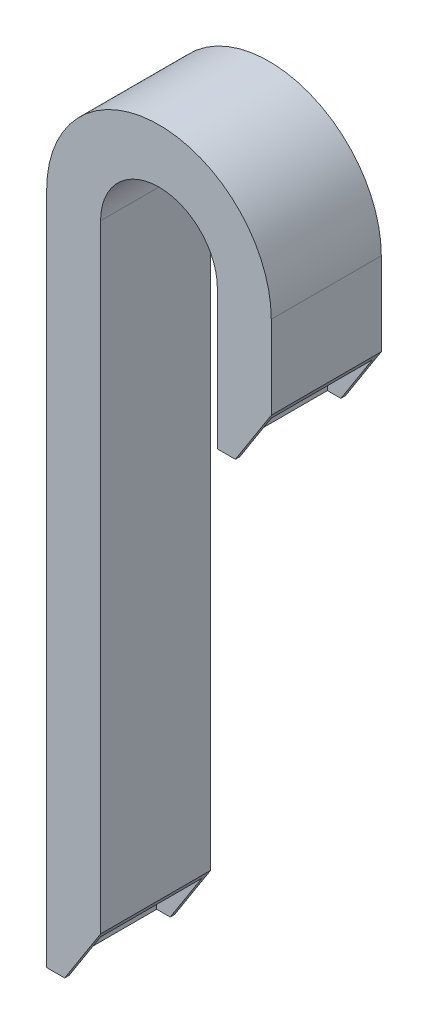
ISO-10303-21;
HEADER;
FILE_DESCRIPTION(('STEP AP214'),'2;1');
FILE_NAME('part.step','',(''),(''),'','','');
FILE_SCHEMA(('AUTOMOTIVE_DESIGN { 1 0 10303 214 1 1 1 1 }'));
ENDSEC;
DATA;
#1=APPLICATION_CONTEXT('core data for automotive mechanical design processes');
#2=APPLICATION_PROTOCOL_DEFINITION('international standard','automotive_design',2000,#1);
#3=PRODUCT_CONTEXT('',#1,'mechanical');
#4=PRODUCT('Part','Part','',(#3));
#5=PRODUCT_RELATED_PRODUCT_CATEGORY('part','',(#4));
#6=PRODUCT_DEFINITION_FORMATION('','',#4);
#7=PRODUCT_DEFINITION_CONTEXT('part definition',#1,'design');
#8=PRODUCT_DEFINITION('design','',#6,#7);
#9=PRODUCT_DEFINITION_SHAPE('','',#8);
#10=(LENGTH_UNIT() NAMED_UNIT(*) SI_UNIT(.MILLI.,.METRE.));
#11=(NAMED_UNIT(*) PLANE_ANGLE_UNIT() SI_UNIT($,.RADIAN.));
#12=(NAMED_UNIT(*) SI_UNIT($,.STERADIAN.) SOLID_ANGLE_UNIT());
#13=UNCERTAINTY_MEASURE_WITH_UNIT(LENGTH_MEASURE(1.E-05),#10,'distance_accuracy_value','');
#14=(GEOMETRIC_REPRESENTATION_CONTEXT(3) GLOBAL_UNCERTAINTY_ASSIGNED_CONTEXT((#13)) GLOBAL_UNIT_ASSIGNED_CONTEXT((#10,
#11,#12)) REPRESENTATION_CONTEXT('',''));
#15=CARTESIAN_POINT('',(0.,0.,0.));
#16=DIRECTION('',(0.,0.,1.));
#17=DIRECTION('',(1.,0.,0.));
#18=AXIS2_PLACEMENT_3D('',#15,#16,#17);
#19=CARTESIAN_POINT('',(88.,238.,24.5));
#20=DIRECTION('',(0.,-1.,0.));
#21=DIRECTION('',(0.,0.,-1.));
#22=AXIS2_PLACEMENT_3D('',#19,#20,#21);
#23=PLANE('',#22);
#24=DIRECTION('',(0.,0.,1.));
#25=VECTOR('',#24,1.);
#26=CARTESIAN_POINT('',(72.,238.,-24.5));
#27=LINE('',#26,#25);
#28=CARTESIAN_POINT('',(72.,238.,22.5));
#29=VERTEX_POINT('',#28);
#30=CARTESIAN_POINT('',(72.,238.,24.5));
#31=VERTEX_POINT('',#30);
#32=EDGE_CURVE('E236',#29,#31,#27,.T.);
#33=ORIENTED_EDGE('',*,*,#32,.T.);
#34=DIRECTION('',(-1.,0.,0.));
#35=VECTOR('',#34,1.);
#36=CARTESIAN_POINT('',(88.,238.,24.5));
#37=LINE('',#36,#35);
#38=CARTESIAN_POINT('',(64.,238.,24.5));
#39=VERTEX_POINT('',#38);
#40=EDGE_CURVE('E271',#31,#39,#37,.T.);
#41=ORIENTED_EDGE('',*,*,#40,.T.);
#42=DIRECTION('',(0.,0.,-1.));
#43=VECTOR('',#42,1.);
#44=CARTESIAN_POINT('',(64.,238.,24.5));
#45=LINE('',#44,#43);
#46=CARTESIAN_POINT('',(64.,238.,-24.5));
#47=VERTEX_POINT('',#46);
#48=EDGE_CURVE('E219',#39,#47,#45,.T.);
#49=ORIENTED_EDGE('',*,*,#48,.T.);
#50=DIRECTION('',(-1.,0.,0.));
#51=VECTOR('',#50,1.);
#52=CARTESIAN_POINT('',(88.,238.,-24.5));
#53=LINE('',#52,#51);
#54=CARTESIAN_POINT('',(72.,238.,-24.5));
#55=VERTEX_POINT('',#54);
#56=EDGE_CURVE('E235',#55,#47,#53,.T.);
#57=ORIENTED_EDGE('',*,*,#56,.F.);
#58=CARTESIAN_POINT('',(72.,238.,-22.5));
#59=VERTEX_POINT('',#58);
#60=EDGE_CURVE('E223',#55,#59,#27,.T.);
#61=ORIENTED_EDGE('',*,*,#60,.T.);
#62=DIRECTION('',(-1.,0.,0.));
#63=VECTOR('',#62,1.);
#64=CARTESIAN_POINT('',(88.,238.,-22.5));
#65=LINE('',#64,#63);
#66=CARTESIAN_POINT('',(66.,238.,-22.5));
#67=VERTEX_POINT('',#66);
#68=EDGE_CURVE('E233',#59,#67,#65,.T.);
#69=ORIENTED_EDGE('',*,*,#68,.T.);
#70=DIRECTION('',(0.,0.,-1.));
#71=VECTOR('',#70,1.);
#72=CARTESIAN_POINT('',(66.,238.,24.5));
#73=LINE('',#72,#71);
#74=CARTESIAN_POINT('',(66.,238.,22.5));
#75=VERTEX_POINT('',#74);
#76=EDGE_CURVE('E250',#75,#67,#73,.T.);
#77=ORIENTED_EDGE('',*,*,#76,.F.);
#78=DIRECTION('',(-1.,0.,0.));
#79=VECTOR('',#78,1.);
#80=CARTESIAN_POINT('',(88.,238.,22.5));
#81=LINE('',#80,#79);
#82=EDGE_CURVE('E252',#29,#75,#81,.T.);
#83=ORIENTED_EDGE('',*,*,#82,.F.);
#84=EDGE_LOOP('',(#33,#41,#49,#57,#61,#69,#77,#83));
#85=FACE_BOUND('',#84,.T.);
#86=ADVANCED_FACE('F39',(#85),#23,.T.);
#87=CARTESIAN_POINT('',(12.,0.,24.5));
#88=DIRECTION('',(0.,-1.,0.));
#89=DIRECTION('',(0.,0.,-1.));
#90=AXIS2_PLACEMENT_3D('',#87,#88,#89);
#91=PLANE('',#90);
#92=DIRECTION('',(0.,0.,1.));
#93=VECTOR('',#92,1.);
#94=CARTESIAN_POINT('',(-4.,0.,-24.5));
#95=LINE('',#94,#93);
#96=CARTESIAN_POINT('',(-4.,0.,22.5));
#97=VERTEX_POINT('',#96);
#98=CARTESIAN_POINT('',(-4.,0.,24.5));
#99=VERTEX_POINT('',#98);
#100=EDGE_CURVE('E192',#97,#99,#95,.T.);
#101=ORIENTED_EDGE('',*,*,#100,.T.);
#102=DIRECTION('',(-1.,0.,0.));
#103=VECTOR('',#102,1.);
#104=CARTESIAN_POINT('',(12.,0.,24.5));
#105=LINE('',#104,#103);
#106=CARTESIAN_POINT('',(-12.,0.,24.5));
#107=VERTEX_POINT('',#106);
#108=EDGE_CURVE('E282',#99,#107,#105,.T.);
#109=ORIENTED_EDGE('',*,*,#108,.T.);
#110=DIRECTION('',(0.,0.,-1.));
#111=VECTOR('',#110,1.);
#112=CARTESIAN_POINT('',(-12.,0.,24.5));
#113=LINE('',#112,#111);
#114=CARTESIAN_POINT('',(-12.,0.,-24.5));
#115=VERTEX_POINT('',#114);
#116=EDGE_CURVE('E212',#107,#115,#113,.T.);
#117=ORIENTED_EDGE('',*,*,#116,.T.);
#118=DIRECTION('',(-1.,0.,0.));
#119=VECTOR('',#118,1.);
#120=CARTESIAN_POINT('',(12.,0.,-24.5));
#121=LINE('',#120,#119);
#122=CARTESIAN_POINT('',(-4.,0.,-24.5));
#123=VERTEX_POINT('',#122);
#124=EDGE_CURVE('E198',#123,#115,#121,.T.);
#125=ORIENTED_EDGE('',*,*,#124,.F.);
#126=CARTESIAN_POINT('',(-4.,0.,-22.5));
#127=VERTEX_POINT('',#126);
#128=EDGE_CURVE('E179',#123,#127,#95,.T.);
#129=ORIENTED_EDGE('',*,*,#128,.T.);
#130=DIRECTION('',(-1.,0.,0.));
#131=VECTOR('',#130,1.);
#132=CARTESIAN_POINT('',(12.,0.,-22.5));
#133=LINE('',#132,#131);
#134=CARTESIAN_POINT('',(-10.,0.,-22.5));
#135=VERTEX_POINT('',#134);
#136=EDGE_CURVE('E265',#127,#135,#133,.T.);
#137=ORIENTED_EDGE('',*,*,#136,.T.);
#138=DIRECTION('',(0.,0.,-1.));
#139=VECTOR('',#138,1.);
#140=CARTESIAN_POINT('',(-10.,0.,24.5));
#141=LINE('',#140,#139);
#142=CARTESIAN_POINT('',(-10.,0.,22.5));
#143=VERTEX_POINT('',#142);
#144=EDGE_CURVE('E260',#143,#135,#141,.T.);
#145=ORIENTED_EDGE('',*,*,#144,.F.);
#146=DIRECTION('',(-1.,0.,0.));
#147=VECTOR('',#146,1.);
#148=CARTESIAN_POINT('',(12.,0.,22.5));
#149=LINE('',#148,#147);
#150=EDGE_CURVE('E256',#97,#143,#149,.T.);
#151=ORIENTED_EDGE('',*,*,#150,.F.);
#152=EDGE_LOOP('',(#101,#109,#117,#125,#129,#137,#145,#151));
#153=FACE_BOUND('',#152,.T.);
#154=ADVANCED_FACE('F366',(#153),#91,.T.);
#155=CARTESIAN_POINT('',(64.,300.,24.5));
#156=DIRECTION('',(1.,0.,0.));
#157=DIRECTION('',(0.,0.,-1.));
#158=AXIS2_PLACEMENT_3D('',#155,#156,#157);
#159=PLANE('',#158);
#160=CARTESIAN_POINT('',(64.,248.,-12.5));
#161=DIRECTION('',(1.,0.,0.));
#162=DIRECTION('',(0.,0.,-1.));
#163=AXIS2_PLACEMENT_3D('',#160,#161,#162);
#164=CIRCLE('',#163,2.25);
#165=CARTESIAN_POINT('',(64.,248.,-14.75));
#166=VERTEX_POINT('',#165);
#167=EDGE_CURVE('E388',#166,#166,#164,.T.);
#168=ORIENTED_EDGE('',*,*,#167,.T.);
#169=EDGE_LOOP('',(#168));
#170=FACE_BOUND('',#169,.T.);
#171=CARTESIAN_POINT('',(64.,248.,12.5));
#172=DIRECTION('',(1.,0.,0.));
#173=DIRECTION('',(0.,0.,-1.));
#174=AXIS2_PLACEMENT_3D('',#171,#172,#173);
#175=CIRCLE('',#174,2.24999999999997);
#176=CARTESIAN_POINT('',(64.,248.,10.25));
#177=VERTEX_POINT('',#176);
#178=EDGE_CURVE('E382',#177,#177,#175,.T.);
#179=ORIENTED_EDGE('',*,*,#178,.T.);
#180=EDGE_LOOP('',(#179));
#181=FACE_BOUND('',#180,.T.);
#182=DIRECTION('',(0.,1.,0.));
#183=VECTOR('',#182,1.);
#184=CARTESIAN_POINT('',(64.,300.,-24.5));
#185=LINE('',#184,#183);
#186=CARTESIAN_POINT('',(64.,300.,-24.5));
#187=VERTEX_POINT('',#186);
#188=EDGE_CURVE('E286',#187,#47,#185,.F.);
#189=ORIENTED_EDGE('',*,*,#188,.T.);
#190=ORIENTED_EDGE('',*,*,#48,.F.);
#191=DIRECTION('',(0.,1.,0.));
#192=VECTOR('',#191,1.);
#193=CARTESIAN_POINT('',(64.,300.,24.5));
#194=LINE('',#193,#192);
#195=CARTESIAN_POINT('',(64.,300.,24.5));
#196=VERTEX_POINT('',#195);
#197=EDGE_CURVE('E200',#196,#39,#194,.F.);
#198=ORIENTED_EDGE('',*,*,#197,.F.);
#199=DIRECTION('',(0.,0.,-1.));
#200=VECTOR('',#199,1.);
#201=CARTESIAN_POINT('',(64.,300.,24.5));
#202=LINE('',#201,#200);
#203=EDGE_CURVE('E206',#196,#187,#202,.T.);
#204=ORIENTED_EDGE('',*,*,#203,.T.);
#205=EDGE_LOOP('',(#189,#190,#198,#204));
#206=FACE_BOUND('',#205,.T.);
#207=ADVANCED_FACE('F41',(#170,#181,#206),#159,.F.);
#208=CARTESIAN_POINT('',(88.,300.,24.5));
#209=DIRECTION('',(1.,0.,0.));
#210=DIRECTION('',(0.,0.,-1.));
#211=AXIS2_PLACEMENT_3D('',#208,#209,#210);
#212=PLANE('',#211);
#213=DIRECTION('',(0.,0.,1.));
#214=VECTOR('',#213,1.);
#215=CARTESIAN_POINT('',(88.,263.,-24.5));
#216=LINE('',#215,#214);
#217=CARTESIAN_POINT('',(88.,263.,-24.5));
#218=VERTEX_POINT('',#217);
#219=CARTESIAN_POINT('',(88.,263.,24.5));
#220=VERTEX_POINT('',#219);
#221=EDGE_CURVE('E310',#218,#220,#216,.T.);
#222=ORIENTED_EDGE('',*,*,#221,.F.);
#223=DIRECTION('',(0.,1.,0.));
#224=VECTOR('',#223,1.);
#225=CARTESIAN_POINT('',(88.,300.,-24.5));
#226=LINE('',#225,#224);
#227=CARTESIAN_POINT('',(88.,300.,-24.5));
#228=VERTEX_POINT('',#227);
#229=EDGE_CURVE('E290',#228,#218,#226,.F.);
#230=ORIENTED_EDGE('',*,*,#229,.F.);
#231=DIRECTION('',(0.,0.,-1.));
#232=VECTOR('',#231,1.);
#233=CARTESIAN_POINT('',(88.,300.,24.5));
#234=LINE('',#233,#232);
#235=CARTESIAN_POINT('',(88.,300.,24.5));
#236=VERTEX_POINT('',#235);
#237=EDGE_CURVE('E217',#236,#228,#234,.T.);
#238=ORIENTED_EDGE('',*,*,#237,.F.);
#239=DIRECTION('',(0.,1.,0.));
#240=VECTOR('',#239,1.);
#241=CARTESIAN_POINT('',(88.,300.,24.5));
#242=LINE('',#241,#240);
#243=EDGE_CURVE('E273',#236,#220,#242,.F.);
#244=ORIENTED_EDGE('',*,*,#243,.T.);
#245=EDGE_LOOP('',(#222,#230,#238,#244));
#246=FACE_BOUND('',#245,.T.);
#247=ADVANCED_FACE('F309',(#246),#212,.T.);
#248=CARTESIAN_POINT('',(38.,300.,24.5));
#249=DIRECTION('',(0.,0.,-1.));
#250=DIRECTION('',(-1.,0.,0.));
#251=AXIS2_PLACEMENT_3D('',#248,#249,#250);
#252=CYLINDRICAL_SURFACE('',#251,50.);
#253=CARTESIAN_POINT('',(38.,300.,-24.5));
#254=DIRECTION('',(0.,0.,1.));
#255=DIRECTION('',(1.,0.,0.));
#256=AXIS2_PLACEMENT_3D('',#253,#254,#255);
#257=CIRCLE('',#256,50.);
#258=CARTESIAN_POINT('',(-12.,300.,-24.5));
#259=VERTEX_POINT('',#258);
#260=EDGE_CURVE('E293',#259,#228,#257,.F.);
#261=ORIENTED_EDGE('',*,*,#260,.F.);
#262=DIRECTION('',(0.,0.,-1.));
#263=VECTOR('',#262,1.);
#264=CARTESIAN_POINT('',(-12.,300.,24.5));
#265=LINE('',#264,#263);
#266=CARTESIAN_POINT('',(-12.,300.,24.5));
#267=VERTEX_POINT('',#266);
#268=EDGE_CURVE('E215',#267,#259,#265,.T.);
#269=ORIENTED_EDGE('',*,*,#268,.F.);
#270=CARTESIAN_POINT('',(38.,300.,24.5));
#271=DIRECTION('',(0.,0.,1.));
#272=DIRECTION('',(1.,0.,0.));
#273=AXIS2_PLACEMENT_3D('',#270,#271,#272);
#274=CIRCLE('',#273,50.);
#275=EDGE_CURVE('E276',#267,#236,#274,.F.);
#276=ORIENTED_EDGE('',*,*,#275,.T.);
#277=ORIENTED_EDGE('',*,*,#237,.T.);
#278=EDGE_LOOP('',(#261,#269,#276,#277));
#279=FACE_BOUND('',#278,.T.);
#280=ADVANCED_FACE('F304',(#279),#252,.T.);
#281=CARTESIAN_POINT('',(-12.,0.,24.5));
#282=DIRECTION('',(-1.,0.,0.));
#283=DIRECTION('',(0.,0.,1.));
#284=AXIS2_PLACEMENT_3D('',#281,#282,#283);
#285=PLANE('',#284);
#286=CARTESIAN_POINT('',(-12.,10.,-12.5));
#287=DIRECTION('',(1.,0.,0.));
#288=DIRECTION('',(0.,0.,-1.));
#289=AXIS2_PLACEMENT_3D('',#286,#287,#288);
#290=CIRCLE('',#289,2.25);
#291=CARTESIAN_POINT('',(-12.,10.,-14.75));
#292=VERTEX_POINT('',#291);
#293=EDGE_CURVE('E376',#292,#292,#290,.T.);
#294=ORIENTED_EDGE('',*,*,#293,.T.);
#295=EDGE_LOOP('',(#294));
#296=FACE_BOUND('',#295,.T.);
#297=CARTESIAN_POINT('',(-12.,10.,12.5));
#298=DIRECTION('',(1.,0.,0.));
#299=DIRECTION('',(0.,0.,-1.));
#300=AXIS2_PLACEMENT_3D('',#297,#298,#299);
#301=CIRCLE('',#300,2.25);
#302=CARTESIAN_POINT('',(-12.,10.,10.25));
#303=VERTEX_POINT('',#302);
#304=EDGE_CURVE('E369',#303,#303,#301,.T.);
#305=ORIENTED_EDGE('',*,*,#304,.T.);
#306=EDGE_LOOP('',(#305));
#307=FACE_BOUND('',#306,.T.);
#308=DIRECTION('',(0.,1.,0.));
#309=VECTOR('',#308,1.);
#310=CARTESIAN_POINT('',(-12.,0.,-24.5));
#311=LINE('',#310,#309);
#312=EDGE_CURVE('E202',#115,#259,#311,.T.);
#313=ORIENTED_EDGE('',*,*,#312,.F.);
#314=ORIENTED_EDGE('',*,*,#116,.F.);
#315=DIRECTION('',(0.,1.,0.));
#316=VECTOR('',#315,1.);
#317=CARTESIAN_POINT('',(-12.,0.,24.5));
#318=LINE('',#317,#316);
#319=EDGE_CURVE('E279',#107,#267,#318,.T.);
#320=ORIENTED_EDGE('',*,*,#319,.T.);
#321=ORIENTED_EDGE('',*,*,#268,.T.);
#322=EDGE_LOOP('',(#313,#314,#320,#321));
#323=FACE_BOUND('',#322,.T.);
#324=ADVANCED_FACE('F300',(#296,#307,#323),#285,.T.);
#325=CARTESIAN_POINT('',(12.,0.,24.5));
#326=DIRECTION('',(-1.,0.,0.));
#327=DIRECTION('',(0.,0.,1.));
#328=AXIS2_PLACEMENT_3D('',#325,#326,#327);
#329=PLANE('',#328);
#330=DIRECTION('',(0.,1.,0.));
#331=VECTOR('',#330,1.);
#332=CARTESIAN_POINT('',(12.,0.,24.5));
#333=LINE('',#332,#331);
#334=CARTESIAN_POINT('',(12.,25.,24.5));
#335=VERTEX_POINT('',#334);
#336=CARTESIAN_POINT('',(12.,300.,24.5));
#337=VERTEX_POINT('',#336);
#338=EDGE_CURVE('E191',#335,#337,#333,.T.);
#339=ORIENTED_EDGE('',*,*,#338,.F.);
#340=DIRECTION('',(0.,0.,1.));
#341=VECTOR('',#340,1.);
#342=CARTESIAN_POINT('',(12.,25.,-24.5));
#343=LINE('',#342,#341);
#344=CARTESIAN_POINT('',(12.,25.,-24.5));
#345=VERTEX_POINT('',#344);
#346=EDGE_CURVE('E176',#345,#335,#343,.T.);
#347=ORIENTED_EDGE('',*,*,#346,.F.);
#348=DIRECTION('',(0.,1.,0.));
#349=VECTOR('',#348,1.);
#350=CARTESIAN_POINT('',(12.,0.,-24.5));
#351=LINE('',#350,#349);
#352=CARTESIAN_POINT('',(12.,300.,-24.5));
#353=VERTEX_POINT('',#352);
#354=EDGE_CURVE('E189',#345,#353,#351,.T.);
#355=ORIENTED_EDGE('',*,*,#354,.T.);
#356=DIRECTION('',(0.,0.,-1.));
#357=VECTOR('',#356,1.);
#358=CARTESIAN_POINT('',(12.,300.,24.5));
#359=LINE('',#358,#357);
#360=EDGE_CURVE('E209',#337,#353,#359,.T.);
#361=ORIENTED_EDGE('',*,*,#360,.F.);
#362=EDGE_LOOP('',(#339,#347,#355,#361));
#363=FACE_BOUND('',#362,.T.);
#364=ADVANCED_FACE('F187',(#363),#329,.F.);
#365=CARTESIAN_POINT('',(38.,300.,24.5));
#366=DIRECTION('',(0.,0.,-1.));
#367=DIRECTION('',(-1.,0.,0.));
#368=AXIS2_PLACEMENT_3D('',#365,#366,#367);
#369=CYLINDRICAL_SURFACE('',#368,26.);
#370=CARTESIAN_POINT('',(38.,300.,-24.5));
#371=DIRECTION('',(0.,0.,1.));
#372=DIRECTION('',(1.,0.,0.));
#373=AXIS2_PLACEMENT_3D('',#370,#371,#372);
#374=CIRCLE('',#373,26.);
#375=EDGE_CURVE('E197',#353,#187,#374,.F.);
#376=ORIENTED_EDGE('',*,*,#375,.T.);
#377=ORIENTED_EDGE('',*,*,#203,.F.);
#378=CARTESIAN_POINT('',(38.,300.,24.5));
#379=DIRECTION('',(0.,0.,1.));
#380=DIRECTION('',(1.,0.,0.));
#381=AXIS2_PLACEMENT_3D('',#378,#379,#380);
#382=CIRCLE('',#381,26.);
#383=EDGE_CURVE('E210',#337,#196,#382,.F.);
#384=ORIENTED_EDGE('',*,*,#383,.F.);
#385=ORIENTED_EDGE('',*,*,#360,.T.);
#386=EDGE_LOOP('',(#376,#377,#384,#385));
#387=FACE_BOUND('',#386,.T.);
#388=ADVANCED_FACE('F431',(#387),#369,.F.);
#389=CARTESIAN_POINT('',(38.,300.,24.5));
#390=DIRECTION('',(0.,0.,1.));
#391=DIRECTION('',(1.,0.,0.));
#392=AXIS2_PLACEMENT_3D('',#389,#390,#391);
#393=PLANE('',#392);
#394=DIRECTION('',(-0.539053696423367,-0.842271400661511,0.));
#395=VECTOR('',#394,1.);
#396=CARTESIAN_POINT('',(-4.,0.,24.5));
#397=LINE('',#396,#395);
#398=EDGE_CURVE('E183',#335,#99,#397,.T.);
#399=ORIENTED_EDGE('',*,*,#398,.F.);
#400=ORIENTED_EDGE('',*,*,#338,.T.);
#401=ORIENTED_EDGE('',*,*,#383,.T.);
#402=ORIENTED_EDGE('',*,*,#197,.T.);
#403=ORIENTED_EDGE('',*,*,#40,.F.);
#404=DIRECTION('',(-0.539053696423367,-0.842271400661511,0.));
#405=VECTOR('',#404,1.);
#406=CARTESIAN_POINT('',(72.,238.,24.5));
#407=LINE('',#406,#405);
#408=EDGE_CURVE('E312',#220,#31,#407,.T.);
#409=ORIENTED_EDGE('',*,*,#408,.F.);
#410=ORIENTED_EDGE('',*,*,#243,.F.);
#411=ORIENTED_EDGE('',*,*,#275,.F.);
#412=ORIENTED_EDGE('',*,*,#319,.F.);
#413=ORIENTED_EDGE('',*,*,#108,.F.);
#414=EDGE_LOOP('',(#399,#400,#401,#402,#403,#409,#410,#411,#412,#413));
#415=FACE_BOUND('',#414,.T.);
#416=ADVANCED_FACE('F434',(#415),#393,.T.);
#417=CARTESIAN_POINT('',(38.,300.,-24.5));
#418=DIRECTION('',(0.,0.,1.));
#419=DIRECTION('',(1.,0.,0.));
#420=AXIS2_PLACEMENT_3D('',#417,#418,#419);
#421=PLANE('',#420);
#422=ORIENTED_EDGE('',*,*,#354,.F.);
#423=DIRECTION('',(-0.539053696423367,-0.842271400661511,0.));
#424=VECTOR('',#423,1.);
#425=CARTESIAN_POINT('',(-4.,0.,-24.5));
#426=LINE('',#425,#424);
#427=EDGE_CURVE('E173',#345,#123,#426,.T.);
#428=ORIENTED_EDGE('',*,*,#427,.T.);
#429=ORIENTED_EDGE('',*,*,#124,.T.);
#430=ORIENTED_EDGE('',*,*,#312,.T.);
#431=ORIENTED_EDGE('',*,*,#260,.T.);
#432=ORIENTED_EDGE('',*,*,#229,.T.);
#433=DIRECTION('',(-0.539053696423367,-0.842271400661511,0.));
#434=VECTOR('',#433,1.);
#435=CARTESIAN_POINT('',(72.,238.,-24.5));
#436=LINE('',#435,#434);
#437=EDGE_CURVE('E311',#218,#55,#436,.T.);
#438=ORIENTED_EDGE('',*,*,#437,.T.);
#439=ORIENTED_EDGE('',*,*,#56,.T.);
#440=ORIENTED_EDGE('',*,*,#188,.F.);
#441=ORIENTED_EDGE('',*,*,#375,.F.);
#442=EDGE_LOOP('',(#422,#428,#429,#430,#431,#432,#438,#439,#440,#441));
#443=FACE_BOUND('',#442,.T.);
#444=ADVANCED_FACE('F195',(#443),#421,.F.);
#445=CARTESIAN_POINT('',(66.,300.,24.5));
#446=DIRECTION('',(1.,0.,0.));
#447=DIRECTION('',(0.,0.,-1.));
#448=AXIS2_PLACEMENT_3D('',#445,#446,#447);
#449=PLANE('',#448);
#450=CARTESIAN_POINT('',(66.,248.,-12.5));
#451=DIRECTION('',(1.,0.,0.));
#452=DIRECTION('',(0.,0.,-1.));
#453=AXIS2_PLACEMENT_3D('',#450,#451,#452);
#454=CIRCLE('',#453,2.25);
#455=CARTESIAN_POINT('',(66.,248.,-14.75));
#456=VERTEX_POINT('',#455);
#457=EDGE_CURVE('E391',#456,#456,#454,.T.);
#458=ORIENTED_EDGE('',*,*,#457,.F.);
#459=EDGE_LOOP('',(#458));
#460=FACE_BOUND('',#459,.T.);
#461=CARTESIAN_POINT('',(66.,248.,12.5));
#462=DIRECTION('',(1.,0.,0.));
#463=DIRECTION('',(0.,0.,-1.));
#464=AXIS2_PLACEMENT_3D('',#461,#462,#463);
#465=CIRCLE('',#464,2.24999999999997);
#466=CARTESIAN_POINT('',(66.,248.,10.25));
#467=VERTEX_POINT('',#466);
#468=EDGE_CURVE('E385',#467,#467,#465,.T.);
#469=ORIENTED_EDGE('',*,*,#468,.F.);
#470=EDGE_LOOP('',(#469));
#471=FACE_BOUND('',#470,.T.);
#472=DIRECTION('',(0.,-1.,0.));
#473=VECTOR('',#472,1.);
#474=CARTESIAN_POINT('',(66.,300.,-22.5));
#475=LINE('',#474,#473);
#476=CARTESIAN_POINT('',(66.,300.,-22.5));
#477=VERTEX_POINT('',#476);
#478=EDGE_CURVE('E241',#477,#67,#475,.T.);
#479=ORIENTED_EDGE('',*,*,#478,.F.);
#480=DIRECTION('',(0.,0.,-1.));
#481=VECTOR('',#480,1.);
#482=CARTESIAN_POINT('',(66.,300.,24.5));
#483=LINE('',#482,#481);
#484=CARTESIAN_POINT('',(66.,300.,22.5));
#485=VERTEX_POINT('',#484);
#486=EDGE_CURVE('E326',#485,#477,#483,.T.);
#487=ORIENTED_EDGE('',*,*,#486,.F.);
#488=DIRECTION('',(0.,-1.,0.));
#489=VECTOR('',#488,1.);
#490=CARTESIAN_POINT('',(66.,300.,22.5));
#491=LINE('',#490,#489);
#492=EDGE_CURVE('E255',#485,#75,#491,.T.);
#493=ORIENTED_EDGE('',*,*,#492,.T.);
#494=ORIENTED_EDGE('',*,*,#76,.T.);
#495=EDGE_LOOP('',(#479,#487,#493,#494));
#496=FACE_BOUND('',#495,.T.);
#497=ADVANCED_FACE('F397',(#460,#471,#496),#449,.T.);
#498=CARTESIAN_POINT('',(86.,300.,24.5));
#499=DIRECTION('',(1.,0.,0.));
#500=DIRECTION('',(0.,0.,-1.));
#501=AXIS2_PLACEMENT_3D('',#498,#499,#500);
#502=PLANE('',#501);
#503=DIRECTION('',(0.,-1.,0.));
#504=VECTOR('',#503,1.);
#505=CARTESIAN_POINT('',(86.,300.,-22.5));
#506=LINE('',#505,#504);
#507=CARTESIAN_POINT('',(86.,300.,-22.5));
#508=VERTEX_POINT('',#507);
#509=CARTESIAN_POINT('',(86.,259.875,-22.5));
#510=VERTEX_POINT('',#509);
#511=EDGE_CURVE('E242',#508,#510,#506,.T.);
#512=ORIENTED_EDGE('',*,*,#511,.T.);
#513=DIRECTION('',(0.,0.,1.));
#514=VECTOR('',#513,1.);
#515=CARTESIAN_POINT('',(86.,259.875,24.5));
#516=LINE('',#515,#514);
#517=CARTESIAN_POINT('',(86.,259.875,22.5));
#518=VERTEX_POINT('',#517);
#519=EDGE_CURVE('E61',#510,#518,#516,.T.);
#520=ORIENTED_EDGE('',*,*,#519,.T.);
#521=DIRECTION('',(0.,-1.,0.));
#522=VECTOR('',#521,1.);
#523=CARTESIAN_POINT('',(86.,300.,22.5));
#524=LINE('',#523,#522);
#525=CARTESIAN_POINT('',(86.,300.,22.5));
#526=VERTEX_POINT('',#525);
#527=EDGE_CURVE('E254',#526,#518,#524,.T.);
#528=ORIENTED_EDGE('',*,*,#527,.F.);
#529=DIRECTION('',(0.,0.,-1.));
#530=VECTOR('',#529,1.);
#531=CARTESIAN_POINT('',(86.,300.,24.5));
#532=LINE('',#531,#530);
#533=EDGE_CURVE('E343',#526,#508,#532,.T.);
#534=ORIENTED_EDGE('',*,*,#533,.T.);
#535=EDGE_LOOP('',(#512,#520,#528,#534));
#536=FACE_BOUND('',#535,.T.);
#537=ADVANCED_FACE('F400',(#536),#502,.F.);
#538=CARTESIAN_POINT('',(38.,300.,24.5));
#539=DIRECTION('',(0.,0.,-1.));
#540=DIRECTION('',(-1.,0.,0.));
#541=AXIS2_PLACEMENT_3D('',#538,#539,#540);
#542=CYLINDRICAL_SURFACE('',#541,48.);
#543=CARTESIAN_POINT('',(38.,300.,-22.5));
#544=DIRECTION('',(0.,0.,1.));
#545=DIRECTION('',(1.,0.,0.));
#546=AXIS2_PLACEMENT_3D('',#543,#544,#545);
#547=CIRCLE('',#546,48.);
#548=CARTESIAN_POINT('',(-10.,300.,-22.5));
#549=VERTEX_POINT('',#548);
#550=EDGE_CURVE('E244',#549,#508,#547,.F.);
#551=ORIENTED_EDGE('',*,*,#550,.T.);
#552=ORIENTED_EDGE('',*,*,#533,.F.);
#553=CARTESIAN_POINT('',(38.,300.,22.5));
#554=DIRECTION('',(0.,0.,1.));
#555=DIRECTION('',(1.,0.,0.));
#556=AXIS2_PLACEMENT_3D('',#553,#554,#555);
#557=CIRCLE('',#556,48.);
#558=CARTESIAN_POINT('',(-10.,300.,22.5));
#559=VERTEX_POINT('',#558);
#560=EDGE_CURVE('E338',#559,#526,#557,.F.);
#561=ORIENTED_EDGE('',*,*,#560,.F.);
#562=DIRECTION('',(0.,0.,1.));
#563=VECTOR('',#562,1.);
#564=CARTESIAN_POINT('',(-10.,300.,24.5));
#565=LINE('',#564,#563);
#566=EDGE_CURVE('E263',#559,#549,#565,.F.);
#567=ORIENTED_EDGE('',*,*,#566,.T.);
#568=EDGE_LOOP('',(#551,#552,#561,#567));
#569=FACE_BOUND('',#568,.T.);
#570=ADVANCED_FACE('F357',(#569),#542,.F.);
#571=CARTESIAN_POINT('',(-10.,0.,24.5));
#572=DIRECTION('',(-1.,0.,0.));
#573=DIRECTION('',(0.,0.,1.));
#574=AXIS2_PLACEMENT_3D('',#571,#572,#573);
#575=PLANE('',#574);
#576=CARTESIAN_POINT('',(-10.,10.,-12.5));
#577=DIRECTION('',(1.,0.,0.));
#578=DIRECTION('',(0.,0.,-1.));
#579=AXIS2_PLACEMENT_3D('',#576,#577,#578);
#580=CIRCLE('',#579,2.24999999999999);
#581=CARTESIAN_POINT('',(-10.,10.,-14.75));
#582=VERTEX_POINT('',#581);
#583=EDGE_CURVE('E379',#582,#582,#580,.T.);
#584=ORIENTED_EDGE('',*,*,#583,.F.);
#585=EDGE_LOOP('',(#584));
#586=FACE_BOUND('',#585,.T.);
#587=CARTESIAN_POINT('',(-10.,10.,12.5));
#588=DIRECTION('',(1.,0.,0.));
#589=DIRECTION('',(0.,0.,-1.));
#590=AXIS2_PLACEMENT_3D('',#587,#588,#589);
#591=CIRCLE('',#590,2.24999999999999);
#592=CARTESIAN_POINT('',(-10.,10.,10.25));
#593=VERTEX_POINT('',#592);
#594=EDGE_CURVE('E373',#593,#593,#591,.T.);
#595=ORIENTED_EDGE('',*,*,#594,.F.);
#596=EDGE_LOOP('',(#595));
#597=FACE_BOUND('',#596,.T.);
#598=DIRECTION('',(0.,1.,0.));
#599=VECTOR('',#598,1.);
#600=CARTESIAN_POINT('',(-10.,0.,-22.5));
#601=LINE('',#600,#599);
#602=EDGE_CURVE('E268',#135,#549,#601,.T.);
#603=ORIENTED_EDGE('',*,*,#602,.T.);
#604=ORIENTED_EDGE('',*,*,#566,.F.);
#605=DIRECTION('',(0.,1.,0.));
#606=VECTOR('',#605,1.);
#607=CARTESIAN_POINT('',(-10.,0.,22.5));
#608=LINE('',#607,#606);
#609=EDGE_CURVE('E259',#143,#559,#608,.T.);
#610=ORIENTED_EDGE('',*,*,#609,.F.);
#611=ORIENTED_EDGE('',*,*,#144,.T.);
#612=EDGE_LOOP('',(#603,#604,#610,#611));
#613=FACE_BOUND('',#612,.T.);
#614=ADVANCED_FACE('F350',(#586,#597,#613),#575,.F.);
#615=CARTESIAN_POINT('',(10.,0.,24.5));
#616=DIRECTION('',(-1.,0.,0.));
#617=DIRECTION('',(0.,0.,1.));
#618=AXIS2_PLACEMENT_3D('',#615,#616,#617);
#619=PLANE('',#618);
#620=DIRECTION('',(0.,0.,-1.));
#621=VECTOR('',#620,1.);
#622=CARTESIAN_POINT('',(10.,21.875,24.5));
#623=LINE('',#622,#621);
#624=CARTESIAN_POINT('',(10.,21.875,22.5));
#625=VERTEX_POINT('',#624);
#626=CARTESIAN_POINT('',(9.99999999999992,21.8749999999997,-22.5));
#627=VERTEX_POINT('',#626);
#628=EDGE_CURVE('E53',#625,#627,#623,.T.);
#629=ORIENTED_EDGE('',*,*,#628,.F.);
#630=DIRECTION('',(0.,1.,0.));
#631=VECTOR('',#630,1.);
#632=CARTESIAN_POINT('',(10.,0.,22.5));
#633=LINE('',#632,#631);
#634=CARTESIAN_POINT('',(9.99999999999999,300.,22.5));
#635=VERTEX_POINT('',#634);
#636=EDGE_CURVE('E258',#625,#635,#633,.T.);
#637=ORIENTED_EDGE('',*,*,#636,.T.);
#638=DIRECTION('',(0.,0.,-1.));
#639=VECTOR('',#638,1.);
#640=CARTESIAN_POINT('',(9.99999999999999,300.,24.5));
#641=LINE('',#640,#639);
#642=CARTESIAN_POINT('',(9.99999999999999,300.,-22.5));
#643=VERTEX_POINT('',#642);
#644=EDGE_CURVE('E264',#635,#643,#641,.T.);
#645=ORIENTED_EDGE('',*,*,#644,.T.);
#646=DIRECTION('',(0.,1.,0.));
#647=VECTOR('',#646,1.);
#648=CARTESIAN_POINT('',(10.,0.,-22.5));
#649=LINE('',#648,#647);
#650=EDGE_CURVE('E267',#627,#643,#649,.T.);
#651=ORIENTED_EDGE('',*,*,#650,.F.);
#652=EDGE_LOOP('',(#629,#637,#645,#651));
#653=FACE_BOUND('',#652,.T.);
#654=ADVANCED_FACE('F448',(#653),#619,.T.);
#655=CARTESIAN_POINT('',(38.,300.,24.5));
#656=DIRECTION('',(0.,0.,-1.));
#657=DIRECTION('',(-1.,0.,0.));
#658=AXIS2_PLACEMENT_3D('',#655,#656,#657);
#659=CYLINDRICAL_SURFACE('',#658,28.);
#660=CARTESIAN_POINT('',(38.,300.,-22.5));
#661=DIRECTION('',(0.,0.,1.));
#662=DIRECTION('',(1.,0.,0.));
#663=AXIS2_PLACEMENT_3D('',#660,#661,#662);
#664=CIRCLE('',#663,28.);
#665=EDGE_CURVE('E325',#643,#477,#664,.F.);
#666=ORIENTED_EDGE('',*,*,#665,.F.);
#667=ORIENTED_EDGE('',*,*,#644,.F.);
#668=CARTESIAN_POINT('',(38.,300.,22.5));
#669=DIRECTION('',(0.,0.,1.));
#670=DIRECTION('',(1.,0.,0.));
#671=AXIS2_PLACEMENT_3D('',#668,#669,#670);
#672=CIRCLE('',#671,28.);
#673=EDGE_CURVE('E329',#635,#485,#672,.F.);
#674=ORIENTED_EDGE('',*,*,#673,.T.);
#675=ORIENTED_EDGE('',*,*,#486,.T.);
#676=EDGE_LOOP('',(#666,#667,#674,#675));
#677=FACE_BOUND('',#676,.T.);
#678=ADVANCED_FACE('F445',(#677),#659,.T.);
#679=CARTESIAN_POINT('',(38.,300.,22.5));
#680=DIRECTION('',(0.,0.,1.));
#681=DIRECTION('',(1.,0.,0.));
#682=AXIS2_PLACEMENT_3D('',#679,#680,#681);
#683=PLANE('',#682);
#684=ORIENTED_EDGE('',*,*,#636,.F.);
#685=DIRECTION('',(-0.539053696423367,-0.842271400661512,0.));
#686=VECTOR('',#685,1.);
#687=CARTESIAN_POINT('',(144.413166855846,231.895573212259,22.5));
#688=LINE('',#687,#686);
#689=EDGE_CURVE('E315',#625,#97,#688,.T.);
#690=ORIENTED_EDGE('',*,*,#689,.T.);
#691=ORIENTED_EDGE('',*,*,#150,.T.);
#692=ORIENTED_EDGE('',*,*,#609,.T.);
#693=ORIENTED_EDGE('',*,*,#560,.T.);
#694=ORIENTED_EDGE('',*,*,#527,.T.);
#695=DIRECTION('',(-0.539053696423367,-0.842271400661511,0.));
#696=VECTOR('',#695,1.);
#697=CARTESIAN_POINT('',(90.2701475595914,266.547105561861,22.5));
#698=LINE('',#697,#696);
#699=EDGE_CURVE('E246',#518,#29,#698,.T.);
#700=ORIENTED_EDGE('',*,*,#699,.T.);
#701=ORIENTED_EDGE('',*,*,#82,.T.);
#702=ORIENTED_EDGE('',*,*,#492,.F.);
#703=ORIENTED_EDGE('',*,*,#673,.F.);
#704=EDGE_LOOP('',(#684,#690,#691,#692,#693,#694,#700,#701,#702,#703));
#705=FACE_BOUND('',#704,.T.);
#706=ADVANCED_FACE('F361',(#705),#683,.F.);
#707=CARTESIAN_POINT('',(38.,300.,-22.5));
#708=DIRECTION('',(0.,0.,1.));
#709=DIRECTION('',(1.,0.,0.));
#710=AXIS2_PLACEMENT_3D('',#707,#708,#709);
#711=PLANE('',#710);
#712=DIRECTION('',(-0.539053696423367,-0.842271400661512,0.));
#713=VECTOR('',#712,1.);
#714=CARTESIAN_POINT('',(144.413166855846,231.895573212259,-22.5));
#715=LINE('',#714,#713);
#716=EDGE_CURVE('E11',#627,#127,#715,.T.);
#717=ORIENTED_EDGE('',*,*,#716,.F.);
#718=ORIENTED_EDGE('',*,*,#650,.T.);
#719=ORIENTED_EDGE('',*,*,#665,.T.);
#720=ORIENTED_EDGE('',*,*,#478,.T.);
#721=ORIENTED_EDGE('',*,*,#68,.F.);
#722=DIRECTION('',(-0.539053696423367,-0.842271400661511,0.));
#723=VECTOR('',#722,1.);
#724=CARTESIAN_POINT('',(90.2701475595914,266.547105561861,-22.5));
#725=LINE('',#724,#723);
#726=EDGE_CURVE('E47',#510,#59,#725,.T.);
#727=ORIENTED_EDGE('',*,*,#726,.F.);
#728=ORIENTED_EDGE('',*,*,#511,.F.);
#729=ORIENTED_EDGE('',*,*,#550,.F.);
#730=ORIENTED_EDGE('',*,*,#602,.F.);
#731=ORIENTED_EDGE('',*,*,#136,.F.);
#732=EDGE_LOOP('',(#717,#718,#719,#720,#721,#727,#728,#729,#730,#731));
#733=FACE_BOUND('',#732,.T.);
#734=ADVANCED_FACE('F239',(#733),#711,.T.);
#735=CARTESIAN_POINT('',(72.,238.,-24.5));
#736=DIRECTION('',(-0.842271400661511,0.539053696423367,0.));
#737=DIRECTION('',(-0.539053696423367,-0.842271400661511,0.));
#738=AXIS2_PLACEMENT_3D('',#735,#736,#737);
#739=PLANE('',#738);
#740=ORIENTED_EDGE('',*,*,#519,.F.);
#741=ORIENTED_EDGE('',*,*,#726,.T.);
#742=ORIENTED_EDGE('',*,*,#60,.F.);
#743=ORIENTED_EDGE('',*,*,#437,.F.);
#744=ORIENTED_EDGE('',*,*,#221,.T.);
#745=ORIENTED_EDGE('',*,*,#408,.T.);
#746=ORIENTED_EDGE('',*,*,#32,.F.);
#747=ORIENTED_EDGE('',*,*,#699,.F.);
#748=EDGE_LOOP('',(#740,#741,#742,#743,#744,#745,#746,#747));
#749=FACE_BOUND('',#748,.T.);
#750=ADVANCED_FACE('F222',(#749),#739,.F.);
#751=CARTESIAN_POINT('',(-4.,0.,-24.5));
#752=DIRECTION('',(-0.842271400661511,0.539053696423367,0.));
#753=DIRECTION('',(-0.539053696423367,-0.842271400661512,0.));
#754=AXIS2_PLACEMENT_3D('',#751,#752,#753);
#755=PLANE('',#754);
#756=ORIENTED_EDGE('',*,*,#628,.T.);
#757=ORIENTED_EDGE('',*,*,#716,.T.);
#758=ORIENTED_EDGE('',*,*,#128,.F.);
#759=ORIENTED_EDGE('',*,*,#427,.F.);
#760=ORIENTED_EDGE('',*,*,#346,.T.);
#761=ORIENTED_EDGE('',*,*,#398,.T.);
#762=ORIENTED_EDGE('',*,*,#100,.F.);
#763=ORIENTED_EDGE('',*,*,#689,.F.);
#764=EDGE_LOOP('',(#756,#757,#758,#759,#760,#761,#762,#763));
#765=FACE_BOUND('',#764,.T.);
#766=ADVANCED_FACE('F175',(#765),#755,.F.);
#767=CARTESIAN_POINT('',(-10.,10.,12.5));
#768=DIRECTION('',(1.,0.,0.));
#769=DIRECTION('',(0.,0.,-1.));
#770=AXIS2_PLACEMENT_3D('',#767,#768,#769);
#771=CYLINDRICAL_SURFACE('',#770,2.24999999999999);
#772=ORIENTED_EDGE('',*,*,#304,.F.);
#773=EDGE_LOOP('',(#772));
#774=FACE_BOUND('',#773,.T.);
#775=ORIENTED_EDGE('',*,*,#594,.T.);
#776=EDGE_LOOP('',(#775));
#777=FACE_BOUND('',#776,.T.);
#778=ADVANCED_FACE('F461',(#774,#777),#771,.F.);
#779=CARTESIAN_POINT('',(-10.,10.,-12.5));
#780=DIRECTION('',(1.,0.,0.));
#781=DIRECTION('',(0.,0.,-1.));
#782=AXIS2_PLACEMENT_3D('',#779,#780,#781);
#783=CYLINDRICAL_SURFACE('',#782,2.24999999999999);
#784=ORIENTED_EDGE('',*,*,#293,.F.);
#785=EDGE_LOOP('',(#784));
#786=FACE_BOUND('',#785,.T.);
#787=ORIENTED_EDGE('',*,*,#583,.T.);
#788=EDGE_LOOP('',(#787));
#789=FACE_BOUND('',#788,.T.);
#790=ADVANCED_FACE('F463',(#786,#789),#783,.F.);
#791=CARTESIAN_POINT('',(66.,248.,12.5));
#792=DIRECTION('',(1.,0.,0.));
#793=DIRECTION('',(0.,0.,-1.));
#794=AXIS2_PLACEMENT_3D('',#791,#792,#793);
#795=CYLINDRICAL_SURFACE('',#794,2.24999999999997);
#796=ORIENTED_EDGE('',*,*,#178,.F.);
#797=EDGE_LOOP('',(#796));
#798=FACE_BOUND('',#797,.T.);
#799=ORIENTED_EDGE('',*,*,#468,.T.);
#800=EDGE_LOOP('',(#799));
#801=FACE_BOUND('',#800,.T.);
#802=ADVANCED_FACE('F470',(#798,#801),#795,.F.);
#803=CARTESIAN_POINT('',(66.,248.,-12.5));
#804=DIRECTION('',(1.,0.,0.));
#805=DIRECTION('',(0.,0.,-1.));
#806=AXIS2_PLACEMENT_3D('',#803,#804,#805);
#807=CYLINDRICAL_SURFACE('',#806,2.25);
#808=ORIENTED_EDGE('',*,*,#167,.F.);
#809=EDGE_LOOP('',(#808));
#810=FACE_BOUND('',#809,.T.);
#811=ORIENTED_EDGE('',*,*,#457,.T.);
#812=EDGE_LOOP('',(#811));
#813=FACE_BOUND('',#812,.T.);
#814=ADVANCED_FACE('F395',(#810,#813),#807,.F.);
#815=CLOSED_SHELL('',(#86,#154,#207,#247,#280,#324,#364,#388,#416,#444,#497,#537,#570,#614,#654,
#678,#706,#734,#750,#766,#778,#790,#802,#814));
#816=MANIFOLD_SOLID_BREP('B2',#815);
#817=ADVANCED_BREP_SHAPE_REPRESENTATION('',(#18,#816),#14);
#818=SHAPE_DEFINITION_REPRESENTATION(#9,#817);
ENDSEC;
END-ISO-10303-21;
